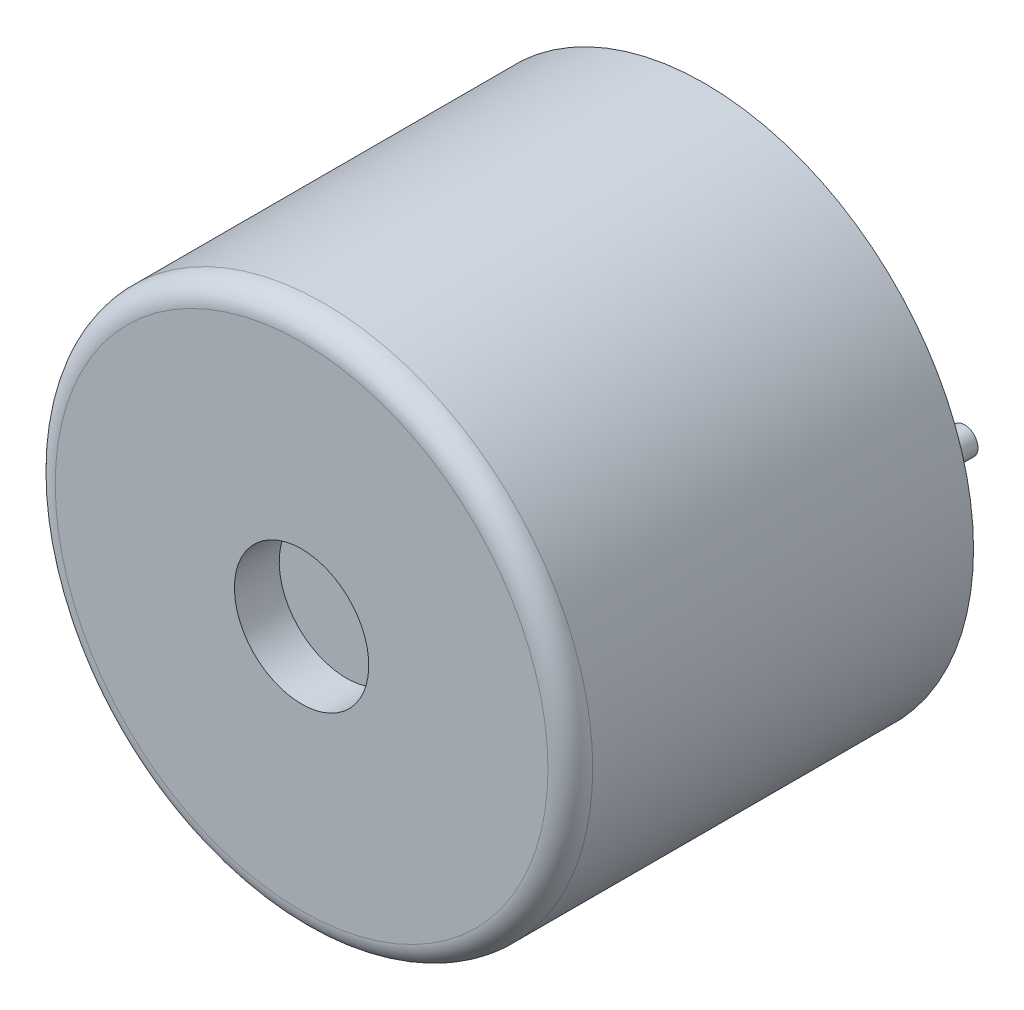
ISO-10303-21;
HEADER;
FILE_DESCRIPTION(('STEP AP214'),'2;1');
FILE_NAME('part.step','',(''),(''),'','','');
FILE_SCHEMA(('AUTOMOTIVE_DESIGN { 1 0 10303 214 1 1 1 1 }'));
ENDSEC;
DATA;
#1=APPLICATION_CONTEXT('core data for automotive mechanical design processes');
#2=APPLICATION_PROTOCOL_DEFINITION('international standard','automotive_design',2000,#1);
#3=PRODUCT_CONTEXT('',#1,'mechanical');
#4=PRODUCT('Part','Part','',(#3));
#5=PRODUCT_RELATED_PRODUCT_CATEGORY('part','',(#4));
#6=PRODUCT_DEFINITION_FORMATION('','',#4);
#7=PRODUCT_DEFINITION_CONTEXT('part definition',#1,'design');
#8=PRODUCT_DEFINITION('design','',#6,#7);
#9=PRODUCT_DEFINITION_SHAPE('','',#8);
#10=(LENGTH_UNIT() NAMED_UNIT(*) SI_UNIT(.MILLI.,.METRE.));
#11=(NAMED_UNIT(*) PLANE_ANGLE_UNIT() SI_UNIT($,.RADIAN.));
#12=(NAMED_UNIT(*) SI_UNIT($,.STERADIAN.) SOLID_ANGLE_UNIT());
#13=UNCERTAINTY_MEASURE_WITH_UNIT(LENGTH_MEASURE(1.E-05),#10,'distance_accuracy_value','');
#14=(GEOMETRIC_REPRESENTATION_CONTEXT(3) GLOBAL_UNCERTAINTY_ASSIGNED_CONTEXT((#13)) GLOBAL_UNIT_ASSIGNED_CONTEXT((#10,
#11,#12)) REPRESENTATION_CONTEXT('',''));
#15=CARTESIAN_POINT('',(0.,0.,0.));
#16=DIRECTION('',(0.,0.,1.));
#17=DIRECTION('',(1.,0.,0.));
#18=AXIS2_PLACEMENT_3D('',#15,#16,#17);
#19=CARTESIAN_POINT('',(3.8,0.,-2.));
#20=DIRECTION('',(0.,0.,1.));
#21=DIRECTION('',(0.,-1.,0.));
#22=AXIS2_PLACEMENT_3D('',#19,#20,#21);
#23=PLANE('',#22);
#24=CARTESIAN_POINT('',(3.8,0.,-2.));
#25=DIRECTION('',(0.,0.,-1.));
#26=DIRECTION('',(0.,-1.,0.));
#27=AXIS2_PLACEMENT_3D('',#24,#25,#26);
#28=CIRCLE('',#27,0.3);
#29=CARTESIAN_POINT('',(3.8,0.3,-2.));
#30=VERTEX_POINT('',#29);
#31=EDGE_CURVE('E105',#30,#30,#28,.T.);
#32=ORIENTED_EDGE('',*,*,#31,.T.);
#33=EDGE_LOOP('',(#32));
#34=FACE_BOUND('',#33,.T.);
#35=ADVANCED_FACE('F17',(#34),#23,.F.);
#36=CARTESIAN_POINT('',(-3.8,0.,-2.));
#37=DIRECTION('',(0.,0.,-1.));
#38=DIRECTION('',(0.,-1.,0.));
#39=AXIS2_PLACEMENT_3D('',#36,#37,#38);
#40=PLANE('',#39);
#41=CARTESIAN_POINT('',(-3.8,0.,-2.));
#42=DIRECTION('',(0.,0.,-1.));
#43=DIRECTION('',(0.,1.,0.));
#44=AXIS2_PLACEMENT_3D('',#41,#42,#43);
#45=CIRCLE('',#44,0.3);
#46=CARTESIAN_POINT('',(-3.8,0.3,-2.));
#47=VERTEX_POINT('',#46);
#48=EDGE_CURVE('E21',#47,#47,#45,.T.);
#49=ORIENTED_EDGE('',*,*,#48,.T.);
#50=EDGE_LOOP('',(#49));
#51=FACE_BOUND('',#50,.T.);
#52=ADVANCED_FACE('F128',(#51),#40,.T.);
#53=CARTESIAN_POINT('',(0.,0.,8.));
#54=DIRECTION('',(0.,0.,1.));
#55=DIRECTION('',(0.,-1.,0.));
#56=AXIS2_PLACEMENT_3D('',#53,#54,#55);
#57=PLANE('',#56);
#58=CARTESIAN_POINT('',(0.,0.,8.));
#59=DIRECTION('',(0.,0.,1.));
#60=DIRECTION('',(0.,-1.,0.));
#61=AXIS2_PLACEMENT_3D('',#58,#59,#60);
#62=CIRCLE('',#61,1.5);
#63=CARTESIAN_POINT('',(0.,1.5,8.));
#64=VERTEX_POINT('',#63);
#65=EDGE_CURVE('E103',#64,#64,#62,.T.);
#66=ORIENTED_EDGE('',*,*,#65,.T.);
#67=EDGE_LOOP('',(#66));
#68=FACE_BOUND('',#67,.T.);
#69=ADVANCED_FACE('F134',(#68),#57,.T.);
#70=CARTESIAN_POINT('',(0.,0.,0.));
#71=DIRECTION('',(0.,0.,1.));
#72=DIRECTION('',(0.,-1.,0.));
#73=AXIS2_PLACEMENT_3D('',#70,#71,#72);
#74=PLANE('',#73);
#75=CARTESIAN_POINT('',(-3.8,0.,0.));
#76=DIRECTION('',(0.,0.,-1.));
#77=DIRECTION('',(0.,-1.,0.));
#78=AXIS2_PLACEMENT_3D('',#75,#76,#77);
#79=CIRCLE('',#78,0.3);
#80=CARTESIAN_POINT('',(-3.8,0.3,0.));
#81=VERTEX_POINT('',#80);
#82=EDGE_CURVE('E109',#81,#81,#79,.T.);
#83=ORIENTED_EDGE('',*,*,#82,.F.);
#84=EDGE_LOOP('',(#83));
#85=FACE_BOUND('',#84,.T.);
#86=CARTESIAN_POINT('',(3.8,0.,0.));
#87=DIRECTION('',(0.,0.,-1.));
#88=DIRECTION('',(0.,-1.,0.));
#89=AXIS2_PLACEMENT_3D('',#86,#87,#88);
#90=CIRCLE('',#89,0.3);
#91=CARTESIAN_POINT('',(3.8,0.3,0.));
#92=VERTEX_POINT('',#91);
#93=EDGE_CURVE('E96',#92,#92,#90,.T.);
#94=ORIENTED_EDGE('',*,*,#93,.F.);
#95=EDGE_LOOP('',(#94));
#96=FACE_BOUND('',#95,.T.);
#97=CARTESIAN_POINT('',(0.,0.,0.));
#98=DIRECTION('',(0.,0.,1.));
#99=DIRECTION('',(0.,-1.,0.));
#100=AXIS2_PLACEMENT_3D('',#97,#98,#99);
#101=CIRCLE('',#100,6.);
#102=CARTESIAN_POINT('',(0.,-6.,0.));
#103=VERTEX_POINT('',#102);
#104=EDGE_CURVE('E28',#103,#103,#101,.T.);
#105=ORIENTED_EDGE('',*,*,#104,.F.);
#106=EDGE_LOOP('',(#105));
#107=FACE_BOUND('',#106,.T.);
#108=ADVANCED_FACE('F144',(#85,#96,#107),#74,.F.);
#109=CARTESIAN_POINT('',(0.,0.,9.));
#110=DIRECTION('',(0.,0.,1.));
#111=DIRECTION('',(0.,-1.,0.));
#112=AXIS2_PLACEMENT_3D('',#109,#110,#111);
#113=PLANE('',#112);
#114=CARTESIAN_POINT('',(0.,0.,9.));
#115=DIRECTION('',(0.,0.,1.));
#116=DIRECTION('',(0.,-1.,0.));
#117=AXIS2_PLACEMENT_3D('',#114,#115,#116);
#118=CIRCLE('',#117,1.5);
#119=CARTESIAN_POINT('',(0.,1.5,9.));
#120=VERTEX_POINT('',#119);
#121=EDGE_CURVE('E86',#120,#120,#118,.T.);
#122=ORIENTED_EDGE('',*,*,#121,.F.);
#123=EDGE_LOOP('',(#122));
#124=FACE_BOUND('',#123,.T.);
#125=CARTESIAN_POINT('',(0.,0.,9.));
#126=DIRECTION('',(0.,0.,1.));
#127=DIRECTION('',(0.,-1.,0.));
#128=AXIS2_PLACEMENT_3D('',#125,#126,#127);
#129=CIRCLE('',#128,5.5);
#130=CARTESIAN_POINT('',(0.,5.5,9.));
#131=VERTEX_POINT('',#130);
#132=EDGE_CURVE('E77',#131,#131,#129,.T.);
#133=ORIENTED_EDGE('',*,*,#132,.T.);
#134=EDGE_LOOP('',(#133));
#135=FACE_BOUND('',#134,.T.);
#136=ADVANCED_FACE('F19',(#124,#135),#113,.T.);
#137=CARTESIAN_POINT('',(0.,0.,9.));
#138=DIRECTION('',(0.,0.,-1.));
#139=DIRECTION('',(0.,1.,0.));
#140=AXIS2_PLACEMENT_3D('',#137,#138,#139);
#141=CYLINDRICAL_SURFACE('',#140,6.);
#142=ORIENTED_EDGE('',*,*,#104,.T.);
#143=DIRECTION('',(0.,0.,1.));
#144=VECTOR('',#143,1.);
#145=CARTESIAN_POINT('',(0.,-6.,9.));
#146=LINE('',#145,#144);
#147=CARTESIAN_POINT('',(0.,-6.,8.5));
#148=VERTEX_POINT('',#147);
#149=EDGE_CURVE('E11',#103,#148,#146,.T.);
#150=ORIENTED_EDGE('',*,*,#149,.T.);
#151=CARTESIAN_POINT('',(0.,0.,8.5));
#152=DIRECTION('',(0.,0.,-1.));
#153=DIRECTION('',(0.,-1.,0.));
#154=AXIS2_PLACEMENT_3D('',#151,#152,#153);
#155=CIRCLE('',#154,6.);
#156=CARTESIAN_POINT('',(0.,6.,8.5));
#157=VERTEX_POINT('',#156);
#158=EDGE_CURVE('E82',#148,#157,#155,.T.);
#159=ORIENTED_EDGE('',*,*,#158,.T.);
#160=CARTESIAN_POINT('',(0.,0.,8.5));
#161=DIRECTION('',(0.,0.,-1.));
#162=DIRECTION('',(0.,-1.,0.));
#163=AXIS2_PLACEMENT_3D('',#160,#161,#162);
#164=CIRCLE('',#163,6.);
#165=EDGE_CURVE('E79',#157,#148,#164,.T.);
#166=ORIENTED_EDGE('',*,*,#165,.T.);
#167=ORIENTED_EDGE('',*,*,#149,.F.);
#168=EDGE_LOOP('',(#142,#150,#159,#166,#167));
#169=FACE_BOUND('',#168,.T.);
#170=ADVANCED_FACE('F150',(#169),#141,.T.);
#171=CARTESIAN_POINT('',(0.,0.,8.5));
#172=DIRECTION('',(0.,0.,1.));
#173=DIRECTION('',(0.,-1.,0.));
#174=AXIS2_PLACEMENT_3D('',#171,#172,#173);
#175=TOROIDAL_SURFACE('',#174,5.5,0.5);
#176=ORIENTED_EDGE('',*,*,#132,.F.);
#177=CARTESIAN_POINT('',(0.,5.5,8.5));
#178=DIRECTION('',(-1.,0.,0.));
#179=DIRECTION('',(0.,1.,0.));
#180=AXIS2_PLACEMENT_3D('',#177,#178,#179);
#181=CIRCLE('',#180,0.5);
#182=EDGE_CURVE('E74',#131,#157,#181,.T.);
#183=ORIENTED_EDGE('',*,*,#182,.T.);
#184=ORIENTED_EDGE('',*,*,#158,.F.);
#185=ORIENTED_EDGE('',*,*,#165,.F.);
#186=ORIENTED_EDGE('',*,*,#182,.F.);
#187=EDGE_LOOP('',(#176,#183,#184,#185,#186));
#188=FACE_BOUND('',#187,.T.);
#189=ADVANCED_FACE('F76',(#188),#175,.T.);
#190=CARTESIAN_POINT('',(0.,0.,8.));
#191=DIRECTION('',(0.,0.,1.));
#192=DIRECTION('',(0.,-1.,0.));
#193=AXIS2_PLACEMENT_3D('',#190,#191,#192);
#194=CYLINDRICAL_SURFACE('',#193,1.5);
#195=ORIENTED_EDGE('',*,*,#65,.F.);
#196=DIRECTION('',(0.,0.,1.));
#197=VECTOR('',#196,1.);
#198=CARTESIAN_POINT('',(0.,1.5,8.));
#199=LINE('',#198,#197);
#200=EDGE_CURVE('E91',#64,#120,#199,.T.);
#201=ORIENTED_EDGE('',*,*,#200,.T.);
#202=ORIENTED_EDGE('',*,*,#121,.T.);
#203=ORIENTED_EDGE('',*,*,#200,.F.);
#204=EDGE_LOOP('',(#195,#201,#202,#203));
#205=FACE_BOUND('',#204,.T.);
#206=ADVANCED_FACE('F142',(#205),#194,.F.);
#207=CARTESIAN_POINT('',(-3.8,0.,-2.));
#208=DIRECTION('',(0.,0.,1.));
#209=DIRECTION('',(0.,-1.,0.));
#210=AXIS2_PLACEMENT_3D('',#207,#208,#209);
#211=CYLINDRICAL_SURFACE('',#210,0.3);
#212=ORIENTED_EDGE('',*,*,#82,.T.);
#213=DIRECTION('',(0.,0.,-1.));
#214=VECTOR('',#213,1.);
#215=CARTESIAN_POINT('',(-3.8,0.3,-2.));
#216=LINE('',#215,#214);
#217=EDGE_CURVE('E113',#81,#47,#216,.T.);
#218=ORIENTED_EDGE('',*,*,#217,.T.);
#219=ORIENTED_EDGE('',*,*,#48,.F.);
#220=ORIENTED_EDGE('',*,*,#217,.F.);
#221=EDGE_LOOP('',(#212,#218,#219,#220));
#222=FACE_BOUND('',#221,.T.);
#223=ADVANCED_FACE('F139',(#222),#211,.T.);
#224=CARTESIAN_POINT('',(3.8,0.,-2.));
#225=DIRECTION('',(0.,0.,1.));
#226=DIRECTION('',(0.,-1.,0.));
#227=AXIS2_PLACEMENT_3D('',#224,#225,#226);
#228=CYLINDRICAL_SURFACE('',#227,0.3);
#229=ORIENTED_EDGE('',*,*,#93,.T.);
#230=DIRECTION('',(0.,0.,-1.));
#231=VECTOR('',#230,1.);
#232=CARTESIAN_POINT('',(3.8,0.3,-2.));
#233=LINE('',#232,#231);
#234=EDGE_CURVE('E100',#92,#30,#233,.T.);
#235=ORIENTED_EDGE('',*,*,#234,.T.);
#236=ORIENTED_EDGE('',*,*,#31,.F.);
#237=ORIENTED_EDGE('',*,*,#234,.F.);
#238=EDGE_LOOP('',(#229,#235,#236,#237));
#239=FACE_BOUND('',#238,.T.);
#240=ADVANCED_FACE('F122',(#239),#228,.T.);
#241=CLOSED_SHELL('',(#35,#52,#69,#108,#136,#170,#189,#206,#223,#240));
#242=MANIFOLD_SOLID_BREP('B1',#241);
#243=ADVANCED_BREP_SHAPE_REPRESENTATION('',(#18,#242),#14);
#244=SHAPE_DEFINITION_REPRESENTATION(#9,#243);
ENDSEC;
END-ISO-10303-21;
